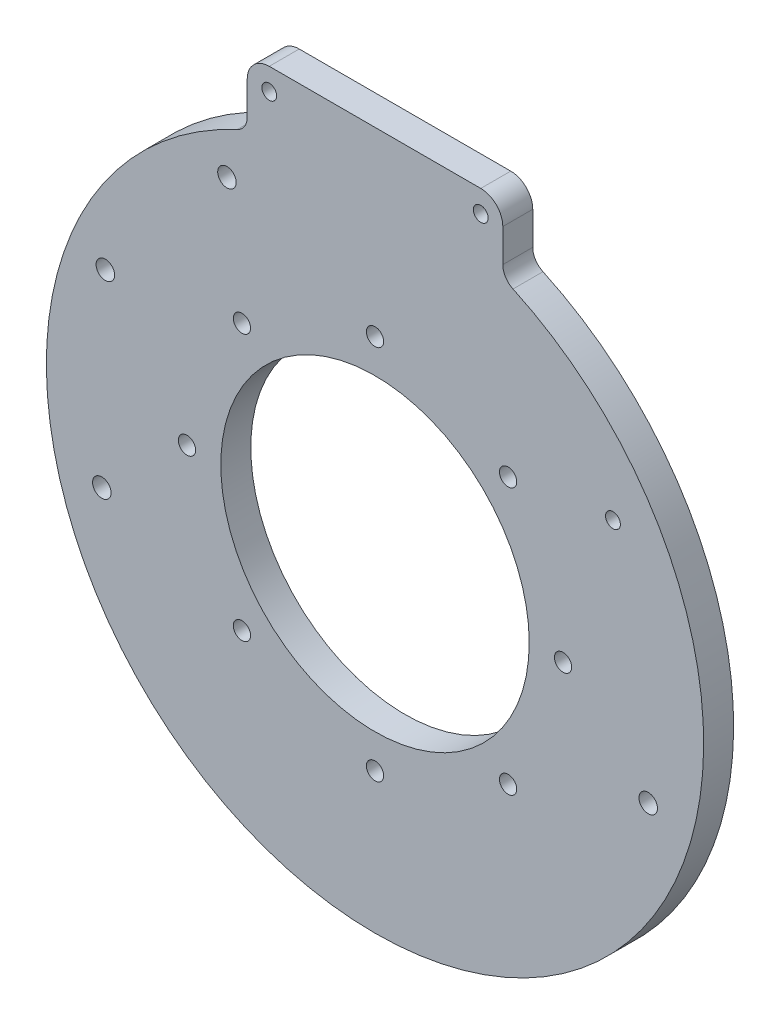
ISO-10303-21;
HEADER;
FILE_DESCRIPTION(('STEP AP214'),'2;1');
FILE_NAME('part.step','',(''),(''),'','','');
FILE_SCHEMA(('AUTOMOTIVE_DESIGN { 1 0 10303 214 1 1 1 1 }'));
ENDSEC;
DATA;
#1=APPLICATION_CONTEXT('core data for automotive mechanical design processes');
#2=APPLICATION_PROTOCOL_DEFINITION('international standard','automotive_design',2000,#1);
#3=PRODUCT_CONTEXT('',#1,'mechanical');
#4=PRODUCT('Part','Part','',(#3));
#5=PRODUCT_RELATED_PRODUCT_CATEGORY('part','',(#4));
#6=PRODUCT_DEFINITION_FORMATION('','',#4);
#7=PRODUCT_DEFINITION_CONTEXT('part definition',#1,'design');
#8=PRODUCT_DEFINITION('design','',#6,#7);
#9=PRODUCT_DEFINITION_SHAPE('','',#8);
#10=(LENGTH_UNIT() NAMED_UNIT(*) SI_UNIT(.MILLI.,.METRE.));
#11=(NAMED_UNIT(*) PLANE_ANGLE_UNIT() SI_UNIT($,.RADIAN.));
#12=(NAMED_UNIT(*) SI_UNIT($,.STERADIAN.) SOLID_ANGLE_UNIT());
#13=UNCERTAINTY_MEASURE_WITH_UNIT(LENGTH_MEASURE(1.E-05),#10,'distance_accuracy_value','');
#14=(GEOMETRIC_REPRESENTATION_CONTEXT(3) GLOBAL_UNCERTAINTY_ASSIGNED_CONTEXT((#13)) GLOBAL_UNIT_ASSIGNED_CONTEXT((#10,
#11,#12)) REPRESENTATION_CONTEXT('',''));
#15=CARTESIAN_POINT('',(0.,0.,0.));
#16=DIRECTION('',(0.,0.,1.));
#17=DIRECTION('',(1.,0.,0.));
#18=AXIS2_PLACEMENT_3D('',#15,#16,#17);
#19=CARTESIAN_POINT('',(82.5,178.304283366639,17.));
#20=DIRECTION('',(0.,0.,1.));
#21=DIRECTION('',(1.,0.,0.));
#22=AXIS2_PLACEMENT_3D('',#19,#20,#21);
#23=PLANE('',#22);
#24=CARTESIAN_POINT('',(-60.,197.,17.));
#25=DIRECTION('',(0.,0.,1.));
#26=DIRECTION('',(1.,0.,0.));
#27=AXIS2_PLACEMENT_3D('',#24,#25,#26);
#28=CIRCLE('',#27,4.2);
#29=CARTESIAN_POINT('',(-55.8,197.,17.));
#30=VERTEX_POINT('',#29);
#31=EDGE_CURVE('E358',#30,#30,#28,.T.);
#32=ORIENTED_EDGE('',*,*,#31,.F.);
#33=EDGE_LOOP('',(#32));
#34=FACE_BOUND('',#33,.T.);
#35=CARTESIAN_POINT('',(60.,197.,17.));
#36=DIRECTION('',(0.,0.,1.));
#37=DIRECTION('',(1.,0.,0.));
#38=AXIS2_PLACEMENT_3D('',#35,#36,#37);
#39=CIRCLE('',#38,4.2);
#40=CARTESIAN_POINT('',(64.2,197.,17.));
#41=VERTEX_POINT('',#40);
#42=EDGE_CURVE('E193',#41,#41,#39,.T.);
#43=ORIENTED_EDGE('',*,*,#42,.F.);
#44=EDGE_LOOP('',(#43));
#45=FACE_BOUND('',#44,.T.);
#46=CARTESIAN_POINT('',(135.,84.,17.));
#47=DIRECTION('',(0.,0.,1.));
#48=DIRECTION('',(1.,0.,0.));
#49=AXIS2_PLACEMENT_3D('',#46,#47,#48);
#50=CIRCLE('',#49,4.19999999999998);
#51=CARTESIAN_POINT('',(139.2,84.,17.));
#52=VERTEX_POINT('',#51);
#53=EDGE_CURVE('E182',#52,#52,#50,.T.);
#54=ORIENTED_EDGE('',*,*,#53,.F.);
#55=EDGE_LOOP('',(#54));
#56=FACE_BOUND('',#55,.T.);
#57=CARTESIAN_POINT('',(155.,-45.,17.));
#58=DIRECTION('',(0.,0.,1.));
#59=DIRECTION('',(1.,0.,0.));
#60=AXIS2_PLACEMENT_3D('',#57,#58,#59);
#61=CIRCLE('',#60,5.25);
#62=CARTESIAN_POINT('',(160.25,-45.,17.));
#63=VERTEX_POINT('',#62);
#64=EDGE_CURVE('E181',#63,#63,#61,.T.);
#65=ORIENTED_EDGE('',*,*,#64,.F.);
#66=EDGE_LOOP('',(#65));
#67=FACE_BOUND('',#66,.T.);
#68=CARTESIAN_POINT('',(-155.,-45.,17.));
#69=DIRECTION('',(0.,0.,1.));
#70=DIRECTION('',(1.,0.,0.));
#71=AXIS2_PLACEMENT_3D('',#68,#69,#70);
#72=CIRCLE('',#71,5.25);
#73=CARTESIAN_POINT('',(-149.75,-45.,17.));
#74=VERTEX_POINT('',#73);
#75=EDGE_CURVE('E199',#74,#74,#72,.T.);
#76=ORIENTED_EDGE('',*,*,#75,.F.);
#77=EDGE_LOOP('',(#76));
#78=FACE_BOUND('',#77,.T.);
#79=CARTESIAN_POINT('',(-153.,63.,17.));
#80=DIRECTION('',(0.,0.,1.));
#81=DIRECTION('',(1.,0.,0.));
#82=AXIS2_PLACEMENT_3D('',#79,#80,#81);
#83=CIRCLE('',#82,5.25);
#84=CARTESIAN_POINT('',(-147.75,63.,17.));
#85=VERTEX_POINT('',#84);
#86=EDGE_CURVE('E205',#85,#85,#83,.T.);
#87=ORIENTED_EDGE('',*,*,#86,.F.);
#88=EDGE_LOOP('',(#87));
#89=FACE_BOUND('',#88,.T.);
#90=CARTESIAN_POINT('',(-84.,143.,17.));
#91=DIRECTION('',(0.,0.,1.));
#92=DIRECTION('',(1.,0.,0.));
#93=AXIS2_PLACEMENT_3D('',#90,#91,#92);
#94=CIRCLE('',#93,5.24999999999999);
#95=CARTESIAN_POINT('',(-78.75,143.,17.));
#96=VERTEX_POINT('',#95);
#97=EDGE_CURVE('E211',#96,#96,#94,.T.);
#98=ORIENTED_EDGE('',*,*,#97,.F.);
#99=EDGE_LOOP('',(#98));
#100=FACE_BOUND('',#99,.T.);
#101=CARTESIAN_POINT('',(75.5071621304083,75.5071621304092,17.));
#102=DIRECTION('',(0.,0.,1.));
#103=DIRECTION('',(1.,0.,0.));
#104=AXIS2_PLACEMENT_3D('',#101,#102,#103);
#105=CIRCLE('',#104,4.9022);
#106=CARTESIAN_POINT('',(80.4093621304083,75.5071621304092,17.));
#107=VERTEX_POINT('',#106);
#108=EDGE_CURVE('E217',#107,#107,#105,.T.);
#109=ORIENTED_EDGE('',*,*,#108,.F.);
#110=EDGE_LOOP('',(#109));
#111=FACE_BOUND('',#110,.T.);
#112=CARTESIAN_POINT('',(75.5071621304155,-75.5071621304083,17.));
#113=DIRECTION('',(0.,0.,1.));
#114=DIRECTION('',(1.,0.,0.));
#115=AXIS2_PLACEMENT_3D('',#112,#113,#114);
#116=CIRCLE('',#115,4.9022);
#117=CARTESIAN_POINT('',(80.4093621304155,-75.5071621304083,17.));
#118=VERTEX_POINT('',#117);
#119=EDGE_CURVE('E178',#118,#118,#116,.T.);
#120=ORIENTED_EDGE('',*,*,#119,.F.);
#121=EDGE_LOOP('',(#120));
#122=FACE_BOUND('',#121,.T.);
#123=CARTESIAN_POINT('',(-75.507162130402,-75.5071621304155,17.));
#124=DIRECTION('',(0.,0.,1.));
#125=DIRECTION('',(1.,0.,0.));
#126=AXIS2_PLACEMENT_3D('',#123,#124,#125);
#127=CIRCLE('',#126,4.9022);
#128=CARTESIAN_POINT('',(-70.604962130402,-75.5071621304155,17.));
#129=VERTEX_POINT('',#128);
#130=EDGE_CURVE('E177',#129,#129,#127,.T.);
#131=ORIENTED_EDGE('',*,*,#130,.F.);
#132=EDGE_LOOP('',(#131));
#133=FACE_BOUND('',#132,.T.);
#134=CARTESIAN_POINT('',(-75.5071621304092,75.507162130402,17.));
#135=DIRECTION('',(0.,0.,1.));
#136=DIRECTION('',(1.,0.,0.));
#137=AXIS2_PLACEMENT_3D('',#134,#135,#136);
#138=CIRCLE('',#137,4.9022);
#139=CARTESIAN_POINT('',(-70.6049621304092,75.507162130402,17.));
#140=VERTEX_POINT('',#139);
#141=EDGE_CURVE('E174',#140,#140,#138,.T.);
#142=ORIENTED_EDGE('',*,*,#141,.F.);
#143=EDGE_LOOP('',(#142));
#144=FACE_BOUND('',#143,.T.);
#145=CARTESIAN_POINT('',(0.,106.68,17.));
#146=DIRECTION('',(0.,0.,1.));
#147=DIRECTION('',(1.,0.,0.));
#148=AXIS2_PLACEMENT_3D('',#145,#146,#147);
#149=CIRCLE('',#148,4.90219999999999);
#150=CARTESIAN_POINT('',(4.90219999999998,106.68,17.));
#151=VERTEX_POINT('',#150);
#152=EDGE_CURVE('E170',#151,#151,#149,.T.);
#153=ORIENTED_EDGE('',*,*,#152,.F.);
#154=EDGE_LOOP('',(#153));
#155=FACE_BOUND('',#154,.T.);
#156=CARTESIAN_POINT('',(106.680000000003,3.00595300391237E-12,17.));
#157=DIRECTION('',(0.,0.,1.));
#158=DIRECTION('',(1.,0.,0.));
#159=AXIS2_PLACEMENT_3D('',#156,#157,#158);
#160=CIRCLE('',#159,4.9022);
#161=CARTESIAN_POINT('',(111.582200000003,3.00595300391237E-12,17.));
#162=VERTEX_POINT('',#161);
#163=EDGE_CURVE('E169',#162,#162,#160,.T.);
#164=ORIENTED_EDGE('',*,*,#163,.F.);
#165=EDGE_LOOP('',(#164));
#166=FACE_BOUND('',#165,.T.);
#167=CARTESIAN_POINT('',(-106.679999999997,-3.01901753596567E-12,17.));
#168=DIRECTION('',(0.,0.,1.));
#169=DIRECTION('',(1.,0.,0.));
#170=AXIS2_PLACEMENT_3D('',#167,#168,#169);
#171=CIRCLE('',#170,4.9022);
#172=CARTESIAN_POINT('',(-101.777799999997,-3.01901753596567E-12,17.));
#173=VERTEX_POINT('',#172);
#174=EDGE_CURVE('E165',#173,#173,#171,.T.);
#175=ORIENTED_EDGE('',*,*,#174,.F.);
#176=EDGE_LOOP('',(#175));
#177=FACE_BOUND('',#176,.T.);
#178=CARTESIAN_POINT('',(6.01190600782474E-12,-106.68,17.));
#179=DIRECTION('',(0.,0.,1.));
#180=DIRECTION('',(1.,0.,0.));
#181=AXIS2_PLACEMENT_3D('',#178,#179,#180);
#182=CIRCLE('',#181,4.90219999999999);
#183=CARTESIAN_POINT('',(4.902200000006,-106.68,17.));
#184=VERTEX_POINT('',#183);
#185=EDGE_CURVE('E164',#184,#184,#182,.T.);
#186=ORIENTED_EDGE('',*,*,#185,.F.);
#187=EDGE_LOOP('',(#186));
#188=FACE_BOUND('',#187,.T.);
#189=CARTESIAN_POINT('',(82.5,178.304283366639,17.));
#190=DIRECTION('',(0.,0.,-1.));
#191=DIRECTION('',(1.,0.,0.));
#192=AXIS2_PLACEMENT_3D('',#189,#190,#191);
#193=CIRCLE('',#192,10.);
#194=CARTESIAN_POINT('',(78.3007880795387,169.228677643215,17.));
#195=VERTEX_POINT('',#194);
#196=CARTESIAN_POINT('',(72.5,178.304283366639,17.));
#197=VERTEX_POINT('',#196);
#198=EDGE_CURVE('E149',#195,#197,#193,.T.);
#199=ORIENTED_EDGE('',*,*,#198,.T.);
#200=DIRECTION('',(0.,1.,0.));
#201=VECTOR('',#200,1.);
#202=CARTESIAN_POINT('',(72.5,197.,17.));
#203=LINE('',#202,#201);
#204=CARTESIAN_POINT('',(72.5,197.,17.));
#205=VERTEX_POINT('',#204);
#206=EDGE_CURVE('E97',#197,#205,#203,.T.);
#207=ORIENTED_EDGE('',*,*,#206,.T.);
#208=CARTESIAN_POINT('',(60.,197.,17.));
#209=DIRECTION('',(0.,0.,1.));
#210=DIRECTION('',(1.,0.,0.));
#211=AXIS2_PLACEMENT_3D('',#208,#209,#210);
#212=CIRCLE('',#211,12.5);
#213=CARTESIAN_POINT('',(60.,209.5,17.));
#214=VERTEX_POINT('',#213);
#215=EDGE_CURVE('E253',#205,#214,#212,.T.);
#216=ORIENTED_EDGE('',*,*,#215,.T.);
#217=DIRECTION('',(-1.,0.,0.));
#218=VECTOR('',#217,1.);
#219=CARTESIAN_POINT('',(-60.,209.5,17.));
#220=LINE('',#219,#218);
#221=CARTESIAN_POINT('',(-60.,209.5,17.));
#222=VERTEX_POINT('',#221);
#223=EDGE_CURVE('E255',#214,#222,#220,.T.);
#224=ORIENTED_EDGE('',*,*,#223,.T.);
#225=CARTESIAN_POINT('',(-60.,197.,17.));
#226=DIRECTION('',(0.,0.,1.));
#227=DIRECTION('',(1.,0.,0.));
#228=AXIS2_PLACEMENT_3D('',#225,#226,#227);
#229=CIRCLE('',#228,12.5);
#230=CARTESIAN_POINT('',(-72.5,197.,17.));
#231=VERTEX_POINT('',#230);
#232=EDGE_CURVE('E116',#222,#231,#229,.T.);
#233=ORIENTED_EDGE('',*,*,#232,.T.);
#234=DIRECTION('',(0.,-1.,0.));
#235=VECTOR('',#234,1.);
#236=CARTESIAN_POINT('',(-72.5,197.,17.));
#237=LINE('',#236,#235);
#238=CARTESIAN_POINT('',(-72.5,178.304283366639,17.));
#239=VERTEX_POINT('',#238);
#240=EDGE_CURVE('E110',#231,#239,#237,.T.);
#241=ORIENTED_EDGE('',*,*,#240,.T.);
#242=CARTESIAN_POINT('',(-82.5,178.304283366639,17.));
#243=DIRECTION('',(0.,0.,-1.));
#244=DIRECTION('',(-1.,0.,0.));
#245=AXIS2_PLACEMENT_3D('',#242,#243,#244);
#246=CIRCLE('',#245,10.);
#247=CARTESIAN_POINT('',(-78.3007880795386,169.228677643215,17.));
#248=VERTEX_POINT('',#247);
#249=EDGE_CURVE('E114',#239,#248,#246,.T.);
#250=ORIENTED_EDGE('',*,*,#249,.T.);
#251=CARTESIAN_POINT('',(0.,0.,17.));
#252=DIRECTION('',(0.,0.,1.));
#253=DIRECTION('',(1.,0.,0.));
#254=AXIS2_PLACEMENT_3D('',#251,#252,#253);
#255=CIRCLE('',#254,186.465435807143);
#256=EDGE_CURVE('E54',#248,#195,#255,.T.);
#257=ORIENTED_EDGE('',*,*,#256,.T.);
#258=EDGE_LOOP('',(#199,#207,#216,#224,#233,#241,#250,#257));
#259=FACE_BOUND('',#258,.T.);
#260=CARTESIAN_POINT('',(0.,0.,17.));
#261=DIRECTION('',(0.,0.,1.));
#262=DIRECTION('',(1.,0.,0.));
#263=AXIS2_PLACEMENT_3D('',#260,#261,#262);
#264=CIRCLE('',#263,87.5);
#265=CARTESIAN_POINT('',(87.5,0.,17.));
#266=VERTEX_POINT('',#265);
#267=EDGE_CURVE('E138',#266,#266,#264,.T.);
#268=ORIENTED_EDGE('',*,*,#267,.F.);
#269=EDGE_LOOP('',(#268));
#270=FACE_BOUND('',#269,.T.);
#271=ADVANCED_FACE('F35',(#34,#45,#56,#67,#78,#89,#100,#111,#122,#133,#144,#155,#166,#177,#188,
#259,#270),#23,.T.);
#272=CARTESIAN_POINT('',(82.5,178.304283366639,0.));
#273=DIRECTION('',(0.,0.,1.));
#274=DIRECTION('',(1.,0.,0.));
#275=AXIS2_PLACEMENT_3D('',#272,#273,#274);
#276=PLANE('',#275);
#277=CARTESIAN_POINT('',(-60.,197.,0.));
#278=DIRECTION('',(0.,0.,1.));
#279=DIRECTION('',(1.,0.,0.));
#280=AXIS2_PLACEMENT_3D('',#277,#278,#279);
#281=CIRCLE('',#280,4.19999999999999);
#282=CARTESIAN_POINT('',(-55.8,197.,0.));
#283=VERTEX_POINT('',#282);
#284=EDGE_CURVE('E361',#283,#283,#281,.T.);
#285=ORIENTED_EDGE('',*,*,#284,.T.);
#286=EDGE_LOOP('',(#285));
#287=FACE_BOUND('',#286,.T.);
#288=CARTESIAN_POINT('',(60.,197.,0.));
#289=DIRECTION('',(0.,0.,1.));
#290=DIRECTION('',(1.,0.,0.));
#291=AXIS2_PLACEMENT_3D('',#288,#289,#290);
#292=CIRCLE('',#291,4.19999999999999);
#293=CARTESIAN_POINT('',(64.2,197.,0.));
#294=VERTEX_POINT('',#293);
#295=EDGE_CURVE('E39',#294,#294,#292,.T.);
#296=ORIENTED_EDGE('',*,*,#295,.T.);
#297=EDGE_LOOP('',(#296));
#298=FACE_BOUND('',#297,.T.);
#299=CARTESIAN_POINT('',(135.,84.,0.));
#300=DIRECTION('',(0.,0.,1.));
#301=DIRECTION('',(1.,0.,0.));
#302=AXIS2_PLACEMENT_3D('',#299,#300,#301);
#303=CIRCLE('',#302,4.19999999999998);
#304=CARTESIAN_POINT('',(139.2,84.,0.));
#305=VERTEX_POINT('',#304);
#306=EDGE_CURVE('E179',#305,#305,#303,.T.);
#307=ORIENTED_EDGE('',*,*,#306,.T.);
#308=EDGE_LOOP('',(#307));
#309=FACE_BOUND('',#308,.T.);
#310=CARTESIAN_POINT('',(155.,-45.,0.));
#311=DIRECTION('',(0.,0.,1.));
#312=DIRECTION('',(1.,0.,0.));
#313=AXIS2_PLACEMENT_3D('',#310,#311,#312);
#314=CIRCLE('',#313,5.24999999999999);
#315=CARTESIAN_POINT('',(160.25,-45.,0.));
#316=VERTEX_POINT('',#315);
#317=EDGE_CURVE('E186',#316,#316,#314,.T.);
#318=ORIENTED_EDGE('',*,*,#317,.T.);
#319=EDGE_LOOP('',(#318));
#320=FACE_BOUND('',#319,.T.);
#321=CARTESIAN_POINT('',(-155.,-45.,0.));
#322=DIRECTION('',(0.,0.,1.));
#323=DIRECTION('',(1.,0.,0.));
#324=AXIS2_PLACEMENT_3D('',#321,#322,#323);
#325=CIRCLE('',#324,5.24999999999999);
#326=CARTESIAN_POINT('',(-149.75,-45.,0.));
#327=VERTEX_POINT('',#326);
#328=EDGE_CURVE('E202',#327,#327,#325,.T.);
#329=ORIENTED_EDGE('',*,*,#328,.T.);
#330=EDGE_LOOP('',(#329));
#331=FACE_BOUND('',#330,.T.);
#332=CARTESIAN_POINT('',(-153.,63.,0.));
#333=DIRECTION('',(0.,0.,1.));
#334=DIRECTION('',(1.,0.,0.));
#335=AXIS2_PLACEMENT_3D('',#332,#333,#334);
#336=CIRCLE('',#335,5.24999999999999);
#337=CARTESIAN_POINT('',(-147.75,63.,0.));
#338=VERTEX_POINT('',#337);
#339=EDGE_CURVE('E208',#338,#338,#336,.T.);
#340=ORIENTED_EDGE('',*,*,#339,.T.);
#341=EDGE_LOOP('',(#340));
#342=FACE_BOUND('',#341,.T.);
#343=CARTESIAN_POINT('',(-84.,143.,0.));
#344=DIRECTION('',(0.,0.,1.));
#345=DIRECTION('',(1.,0.,0.));
#346=AXIS2_PLACEMENT_3D('',#343,#344,#345);
#347=CIRCLE('',#346,5.24999999999999);
#348=CARTESIAN_POINT('',(-78.75,143.,0.));
#349=VERTEX_POINT('',#348);
#350=EDGE_CURVE('E214',#349,#349,#347,.T.);
#351=ORIENTED_EDGE('',*,*,#350,.T.);
#352=EDGE_LOOP('',(#351));
#353=FACE_BOUND('',#352,.T.);
#354=CARTESIAN_POINT('',(75.5071621304083,75.5071621304092,0.));
#355=DIRECTION('',(0.,0.,1.));
#356=DIRECTION('',(1.,0.,0.));
#357=AXIS2_PLACEMENT_3D('',#354,#355,#356);
#358=CIRCLE('',#357,4.90219999999999);
#359=CARTESIAN_POINT('',(80.4093621304083,75.5071621304092,0.));
#360=VERTEX_POINT('',#359);
#361=EDGE_CURVE('E220',#360,#360,#358,.T.);
#362=ORIENTED_EDGE('',*,*,#361,.T.);
#363=EDGE_LOOP('',(#362));
#364=FACE_BOUND('',#363,.T.);
#365=CARTESIAN_POINT('',(75.5071621304155,-75.5071621304083,0.));
#366=DIRECTION('',(0.,0.,1.));
#367=DIRECTION('',(1.,0.,0.));
#368=AXIS2_PLACEMENT_3D('',#365,#366,#367);
#369=CIRCLE('',#368,4.90219999999999);
#370=CARTESIAN_POINT('',(80.4093621304155,-75.5071621304083,0.));
#371=VERTEX_POINT('',#370);
#372=EDGE_CURVE('E175',#371,#371,#369,.T.);
#373=ORIENTED_EDGE('',*,*,#372,.T.);
#374=EDGE_LOOP('',(#373));
#375=FACE_BOUND('',#374,.T.);
#376=CARTESIAN_POINT('',(-75.507162130402,-75.5071621304155,0.));
#377=DIRECTION('',(0.,0.,1.));
#378=DIRECTION('',(1.,0.,0.));
#379=AXIS2_PLACEMENT_3D('',#376,#377,#378);
#380=CIRCLE('',#379,4.90219999999999);
#381=CARTESIAN_POINT('',(-70.604962130402,-75.5071621304155,0.));
#382=VERTEX_POINT('',#381);
#383=EDGE_CURVE('E227',#382,#382,#380,.T.);
#384=ORIENTED_EDGE('',*,*,#383,.T.);
#385=EDGE_LOOP('',(#384));
#386=FACE_BOUND('',#385,.T.);
#387=CARTESIAN_POINT('',(-75.5071621304092,75.507162130402,0.));
#388=DIRECTION('',(0.,0.,1.));
#389=DIRECTION('',(1.,0.,0.));
#390=AXIS2_PLACEMENT_3D('',#387,#388,#389);
#391=CIRCLE('',#390,4.90219999999999);
#392=CARTESIAN_POINT('',(-70.6049621304092,75.507162130402,0.));
#393=VERTEX_POINT('',#392);
#394=EDGE_CURVE('E171',#393,#393,#391,.T.);
#395=ORIENTED_EDGE('',*,*,#394,.T.);
#396=EDGE_LOOP('',(#395));
#397=FACE_BOUND('',#396,.T.);
#398=CARTESIAN_POINT('',(0.,106.68,0.));
#399=DIRECTION('',(0.,0.,1.));
#400=DIRECTION('',(1.,0.,0.));
#401=AXIS2_PLACEMENT_3D('',#398,#399,#400);
#402=CIRCLE('',#401,4.90219999999999);
#403=CARTESIAN_POINT('',(4.90219999999998,106.68,0.));
#404=VERTEX_POINT('',#403);
#405=EDGE_CURVE('E166',#404,#404,#402,.T.);
#406=ORIENTED_EDGE('',*,*,#405,.T.);
#407=EDGE_LOOP('',(#406));
#408=FACE_BOUND('',#407,.T.);
#409=CARTESIAN_POINT('',(106.680000000003,3.00595300391237E-12,0.));
#410=DIRECTION('',(0.,0.,1.));
#411=DIRECTION('',(1.,0.,0.));
#412=AXIS2_PLACEMENT_3D('',#409,#410,#411);
#413=CIRCLE('',#412,4.90219999999999);
#414=CARTESIAN_POINT('',(111.582200000003,3.00595300391237E-12,0.));
#415=VERTEX_POINT('',#414);
#416=EDGE_CURVE('E236',#415,#415,#413,.T.);
#417=ORIENTED_EDGE('',*,*,#416,.T.);
#418=EDGE_LOOP('',(#417));
#419=FACE_BOUND('',#418,.T.);
#420=CARTESIAN_POINT('',(-106.679999999997,-3.01901753596567E-12,0.));
#421=DIRECTION('',(0.,0.,1.));
#422=DIRECTION('',(1.,0.,0.));
#423=AXIS2_PLACEMENT_3D('',#420,#421,#422);
#424=CIRCLE('',#423,4.90219999999999);
#425=CARTESIAN_POINT('',(-101.777799999997,-3.01901753596567E-12,0.));
#426=VERTEX_POINT('',#425);
#427=EDGE_CURVE('E161',#426,#426,#424,.T.);
#428=ORIENTED_EDGE('',*,*,#427,.T.);
#429=EDGE_LOOP('',(#428));
#430=FACE_BOUND('',#429,.T.);
#431=CARTESIAN_POINT('',(6.01190600782474E-12,-106.68,0.));
#432=DIRECTION('',(0.,0.,1.));
#433=DIRECTION('',(1.,0.,0.));
#434=AXIS2_PLACEMENT_3D('',#431,#432,#433);
#435=CIRCLE('',#434,4.90219999999999);
#436=CARTESIAN_POINT('',(4.902200000006,-106.68,0.));
#437=VERTEX_POINT('',#436);
#438=EDGE_CURVE('E243',#437,#437,#435,.T.);
#439=ORIENTED_EDGE('',*,*,#438,.T.);
#440=EDGE_LOOP('',(#439));
#441=FACE_BOUND('',#440,.T.);
#442=CARTESIAN_POINT('',(82.5,178.304283366639,0.));
#443=DIRECTION('',(0.,0.,-1.));
#444=DIRECTION('',(1.,0.,0.));
#445=AXIS2_PLACEMENT_3D('',#442,#443,#444);
#446=CIRCLE('',#445,10.);
#447=CARTESIAN_POINT('',(78.3007880795387,169.228677643215,0.));
#448=VERTEX_POINT('',#447);
#449=CARTESIAN_POINT('',(72.5,178.304283366639,0.));
#450=VERTEX_POINT('',#449);
#451=EDGE_CURVE('E134',#448,#450,#446,.T.);
#452=ORIENTED_EDGE('',*,*,#451,.F.);
#453=CARTESIAN_POINT('',(0.,0.,0.));
#454=DIRECTION('',(0.,0.,1.));
#455=DIRECTION('',(1.,0.,0.));
#456=AXIS2_PLACEMENT_3D('',#453,#454,#455);
#457=CIRCLE('',#456,186.465435807143);
#458=CARTESIAN_POINT('',(-78.3007880795386,169.228677643215,0.));
#459=VERTEX_POINT('',#458);
#460=EDGE_CURVE('E89',#459,#448,#457,.T.);
#461=ORIENTED_EDGE('',*,*,#460,.F.);
#462=CARTESIAN_POINT('',(-82.5,178.304283366639,0.));
#463=DIRECTION('',(0.,0.,-1.));
#464=DIRECTION('',(-1.,0.,0.));
#465=AXIS2_PLACEMENT_3D('',#462,#463,#464);
#466=CIRCLE('',#465,10.);
#467=CARTESIAN_POINT('',(-72.5,178.304283366639,0.));
#468=VERTEX_POINT('',#467);
#469=EDGE_CURVE('E83',#468,#459,#466,.T.);
#470=ORIENTED_EDGE('',*,*,#469,.F.);
#471=DIRECTION('',(0.,-1.,0.));
#472=VECTOR('',#471,1.);
#473=CARTESIAN_POINT('',(-72.5,197.,0.));
#474=LINE('',#473,#472);
#475=CARTESIAN_POINT('',(-72.5,197.,0.));
#476=VERTEX_POINT('',#475);
#477=EDGE_CURVE('E124',#476,#468,#474,.T.);
#478=ORIENTED_EDGE('',*,*,#477,.F.);
#479=CARTESIAN_POINT('',(-60.,197.,0.));
#480=DIRECTION('',(0.,0.,1.));
#481=DIRECTION('',(1.,0.,0.));
#482=AXIS2_PLACEMENT_3D('',#479,#480,#481);
#483=CIRCLE('',#482,12.5);
#484=CARTESIAN_POINT('',(-60.,209.5,0.));
#485=VERTEX_POINT('',#484);
#486=EDGE_CURVE('E144',#485,#476,#483,.T.);
#487=ORIENTED_EDGE('',*,*,#486,.F.);
#488=DIRECTION('',(-1.,0.,0.));
#489=VECTOR('',#488,1.);
#490=CARTESIAN_POINT('',(-60.,209.5,0.));
#491=LINE('',#490,#489);
#492=CARTESIAN_POINT('',(60.,209.5,0.));
#493=VERTEX_POINT('',#492);
#494=EDGE_CURVE('E142',#493,#485,#491,.T.);
#495=ORIENTED_EDGE('',*,*,#494,.F.);
#496=CARTESIAN_POINT('',(60.,197.,0.));
#497=DIRECTION('',(0.,0.,1.));
#498=DIRECTION('',(1.,0.,0.));
#499=AXIS2_PLACEMENT_3D('',#496,#497,#498);
#500=CIRCLE('',#499,12.5);
#501=CARTESIAN_POINT('',(72.5,197.,0.));
#502=VERTEX_POINT('',#501);
#503=EDGE_CURVE('E140',#502,#493,#500,.T.);
#504=ORIENTED_EDGE('',*,*,#503,.F.);
#505=DIRECTION('',(0.,1.,0.));
#506=VECTOR('',#505,1.);
#507=CARTESIAN_POINT('',(72.5,197.,0.));
#508=LINE('',#507,#506);
#509=EDGE_CURVE('E137',#450,#502,#508,.T.);
#510=ORIENTED_EDGE('',*,*,#509,.F.);
#511=EDGE_LOOP('',(#452,#461,#470,#478,#487,#495,#504,#510));
#512=FACE_BOUND('',#511,.T.);
#513=CARTESIAN_POINT('',(0.,0.,0.));
#514=DIRECTION('',(0.,0.,1.));
#515=DIRECTION('',(1.,0.,0.));
#516=AXIS2_PLACEMENT_3D('',#513,#514,#515);
#517=CIRCLE('',#516,87.5);
#518=CARTESIAN_POINT('',(87.5,0.,0.));
#519=VERTEX_POINT('',#518);
#520=EDGE_CURVE('E246',#519,#519,#517,.T.);
#521=ORIENTED_EDGE('',*,*,#520,.T.);
#522=EDGE_LOOP('',(#521));
#523=FACE_BOUND('',#522,.T.);
#524=ADVANCED_FACE('F268',(#287,#298,#309,#320,#331,#342,#353,#364,#375,#386,#397,#408,#419,
#430,#441,#512,#523),#276,.F.);
#525=CARTESIAN_POINT('',(82.5,178.304283366639,17.));
#526=DIRECTION('',(0.,0.,-1.));
#527=DIRECTION('',(-1.,0.,0.));
#528=AXIS2_PLACEMENT_3D('',#525,#526,#527);
#529=CYLINDRICAL_SURFACE('',#528,10.);
#530=ORIENTED_EDGE('',*,*,#451,.T.);
#531=DIRECTION('',(0.,0.,-1.));
#532=VECTOR('',#531,1.);
#533=CARTESIAN_POINT('',(72.5,178.304283366639,17.));
#534=LINE('',#533,#532);
#535=EDGE_CURVE('E11',#197,#450,#534,.T.);
#536=ORIENTED_EDGE('',*,*,#535,.F.);
#537=ORIENTED_EDGE('',*,*,#198,.F.);
#538=DIRECTION('',(0.,0.,-1.));
#539=VECTOR('',#538,1.);
#540=CARTESIAN_POINT('',(78.3007880795387,169.228677643215,17.));
#541=LINE('',#540,#539);
#542=EDGE_CURVE('E130',#195,#448,#541,.T.);
#543=ORIENTED_EDGE('',*,*,#542,.T.);
#544=EDGE_LOOP('',(#530,#536,#537,#543));
#545=FACE_BOUND('',#544,.T.);
#546=ADVANCED_FACE('F37',(#545),#529,.F.);
#547=CARTESIAN_POINT('',(72.5,197.,17.));
#548=DIRECTION('',(-1.,0.,0.));
#549=DIRECTION('',(0.,0.,1.));
#550=AXIS2_PLACEMENT_3D('',#547,#548,#549);
#551=PLANE('',#550);
#552=ORIENTED_EDGE('',*,*,#509,.T.);
#553=DIRECTION('',(0.,0.,-1.));
#554=VECTOR('',#553,1.);
#555=CARTESIAN_POINT('',(72.5,197.,17.));
#556=LINE('',#555,#554);
#557=EDGE_CURVE('E45',#205,#502,#556,.T.);
#558=ORIENTED_EDGE('',*,*,#557,.F.);
#559=ORIENTED_EDGE('',*,*,#206,.F.);
#560=ORIENTED_EDGE('',*,*,#535,.T.);
#561=EDGE_LOOP('',(#552,#558,#559,#560));
#562=FACE_BOUND('',#561,.T.);
#563=ADVANCED_FACE('F534',(#562),#551,.F.);
#564=CARTESIAN_POINT('',(60.,197.,17.));
#565=DIRECTION('',(0.,0.,-1.));
#566=DIRECTION('',(-1.,0.,0.));
#567=AXIS2_PLACEMENT_3D('',#564,#565,#566);
#568=CYLINDRICAL_SURFACE('',#567,12.5);
#569=ORIENTED_EDGE('',*,*,#503,.T.);
#570=DIRECTION('',(0.,0.,-1.));
#571=VECTOR('',#570,1.);
#572=CARTESIAN_POINT('',(60.,209.5,17.));
#573=LINE('',#572,#571);
#574=EDGE_CURVE('E156',#214,#493,#573,.T.);
#575=ORIENTED_EDGE('',*,*,#574,.F.);
#576=ORIENTED_EDGE('',*,*,#215,.F.);
#577=ORIENTED_EDGE('',*,*,#557,.T.);
#578=EDGE_LOOP('',(#569,#575,#576,#577));
#579=FACE_BOUND('',#578,.T.);
#580=ADVANCED_FACE('F525',(#579),#568,.T.);
#581=CARTESIAN_POINT('',(-60.,209.5,17.));
#582=DIRECTION('',(0.,-1.,0.));
#583=DIRECTION('',(0.,0.,-1.));
#584=AXIS2_PLACEMENT_3D('',#581,#582,#583);
#585=PLANE('',#584);
#586=ORIENTED_EDGE('',*,*,#494,.T.);
#587=DIRECTION('',(0.,0.,-1.));
#588=VECTOR('',#587,1.);
#589=CARTESIAN_POINT('',(-60.,209.5,17.));
#590=LINE('',#589,#588);
#591=EDGE_CURVE('E153',#222,#485,#590,.T.);
#592=ORIENTED_EDGE('',*,*,#591,.F.);
#593=ORIENTED_EDGE('',*,*,#223,.F.);
#594=ORIENTED_EDGE('',*,*,#574,.T.);
#595=EDGE_LOOP('',(#586,#592,#593,#594));
#596=FACE_BOUND('',#595,.T.);
#597=ADVANCED_FACE('F261',(#596),#585,.F.);
#598=CARTESIAN_POINT('',(-60.,197.,17.));
#599=DIRECTION('',(0.,0.,-1.));
#600=DIRECTION('',(-1.,0.,0.));
#601=AXIS2_PLACEMENT_3D('',#598,#599,#600);
#602=CYLINDRICAL_SURFACE('',#601,12.5);
#603=ORIENTED_EDGE('',*,*,#486,.T.);
#604=DIRECTION('',(0.,0.,-1.));
#605=VECTOR('',#604,1.);
#606=CARTESIAN_POINT('',(-72.5,197.,17.));
#607=LINE('',#606,#605);
#608=EDGE_CURVE('E125',#231,#476,#607,.T.);
#609=ORIENTED_EDGE('',*,*,#608,.F.);
#610=ORIENTED_EDGE('',*,*,#232,.F.);
#611=ORIENTED_EDGE('',*,*,#591,.T.);
#612=EDGE_LOOP('',(#603,#609,#610,#611));
#613=FACE_BOUND('',#612,.T.);
#614=ADVANCED_FACE('F265',(#613),#602,.T.);
#615=CARTESIAN_POINT('',(-72.5,197.,17.));
#616=DIRECTION('',(1.,0.,0.));
#617=DIRECTION('',(0.,0.,-1.));
#618=AXIS2_PLACEMENT_3D('',#615,#616,#617);
#619=PLANE('',#618);
#620=ORIENTED_EDGE('',*,*,#477,.T.);
#621=DIRECTION('',(0.,0.,-1.));
#622=VECTOR('',#621,1.);
#623=CARTESIAN_POINT('',(-72.5,178.304283366639,17.));
#624=LINE('',#623,#622);
#625=EDGE_CURVE('E121',#239,#468,#624,.T.);
#626=ORIENTED_EDGE('',*,*,#625,.F.);
#627=ORIENTED_EDGE('',*,*,#240,.F.);
#628=ORIENTED_EDGE('',*,*,#608,.T.);
#629=EDGE_LOOP('',(#620,#626,#627,#628));
#630=FACE_BOUND('',#629,.T.);
#631=ADVANCED_FACE('F122',(#630),#619,.F.);
#632=CARTESIAN_POINT('',(-82.5,178.304283366639,17.));
#633=DIRECTION('',(0.,0.,-1.));
#634=DIRECTION('',(-1.,0.,0.));
#635=AXIS2_PLACEMENT_3D('',#632,#633,#634);
#636=CYLINDRICAL_SURFACE('',#635,10.);
#637=ORIENTED_EDGE('',*,*,#469,.T.);
#638=DIRECTION('',(0.,0.,-1.));
#639=VECTOR('',#638,1.);
#640=CARTESIAN_POINT('',(-78.3007880795386,169.228677643215,17.));
#641=LINE('',#640,#639);
#642=EDGE_CURVE('E126',#248,#459,#641,.T.);
#643=ORIENTED_EDGE('',*,*,#642,.F.);
#644=ORIENTED_EDGE('',*,*,#249,.F.);
#645=ORIENTED_EDGE('',*,*,#625,.T.);
#646=EDGE_LOOP('',(#637,#643,#644,#645));
#647=FACE_BOUND('',#646,.T.);
#648=ADVANCED_FACE('F128',(#647),#636,.F.);
#649=CARTESIAN_POINT('',(0.,0.,17.));
#650=DIRECTION('',(0.,0.,-1.));
#651=DIRECTION('',(-1.,0.,0.));
#652=AXIS2_PLACEMENT_3D('',#649,#650,#651);
#653=CYLINDRICAL_SURFACE('',#652,186.465435807143);
#654=ORIENTED_EDGE('',*,*,#460,.T.);
#655=ORIENTED_EDGE('',*,*,#542,.F.);
#656=ORIENTED_EDGE('',*,*,#256,.F.);
#657=ORIENTED_EDGE('',*,*,#642,.T.);
#658=EDGE_LOOP('',(#654,#655,#656,#657));
#659=FACE_BOUND('',#658,.T.);
#660=ADVANCED_FACE('F274',(#659),#653,.T.);
#661=CARTESIAN_POINT('',(0.,0.,17.));
#662=DIRECTION('',(0.,0.,-1.));
#663=DIRECTION('',(-1.,0.,0.));
#664=AXIS2_PLACEMENT_3D('',#661,#662,#663);
#665=CYLINDRICAL_SURFACE('',#664,87.5);
#666=ORIENTED_EDGE('',*,*,#267,.T.);
#667=EDGE_LOOP('',(#666));
#668=FACE_BOUND('',#667,.T.);
#669=ORIENTED_EDGE('',*,*,#520,.F.);
#670=EDGE_LOOP('',(#669));
#671=FACE_BOUND('',#670,.T.);
#672=ADVANCED_FACE('F276',(#668,#671),#665,.F.);
#673=CARTESIAN_POINT('',(6.01190600782474E-12,-106.68,17.));
#674=DIRECTION('',(0.,0.,1.));
#675=DIRECTION('',(1.,0.,0.));
#676=AXIS2_PLACEMENT_3D('',#673,#674,#675);
#677=CYLINDRICAL_SURFACE('',#676,4.90219999999999);
#678=ORIENTED_EDGE('',*,*,#185,.T.);
#679=EDGE_LOOP('',(#678));
#680=FACE_BOUND('',#679,.T.);
#681=ORIENTED_EDGE('',*,*,#438,.F.);
#682=EDGE_LOOP('',(#681));
#683=FACE_BOUND('',#682,.T.);
#684=ADVANCED_FACE('F282',(#680,#683),#677,.F.);
#685=CARTESIAN_POINT('',(-106.679999999997,-3.01901753596567E-12,17.));
#686=DIRECTION('',(0.,0.,1.));
#687=DIRECTION('',(1.,0.,0.));
#688=AXIS2_PLACEMENT_3D('',#685,#686,#687);
#689=CYLINDRICAL_SURFACE('',#688,4.90219999999999);
#690=ORIENTED_EDGE('',*,*,#174,.T.);
#691=EDGE_LOOP('',(#690));
#692=FACE_BOUND('',#691,.T.);
#693=ORIENTED_EDGE('',*,*,#427,.F.);
#694=EDGE_LOOP('',(#693));
#695=FACE_BOUND('',#694,.T.);
#696=ADVANCED_FACE('F299',(#692,#695),#689,.F.);
#697=CARTESIAN_POINT('',(106.680000000003,3.00595300391237E-12,17.));
#698=DIRECTION('',(0.,0.,1.));
#699=DIRECTION('',(1.,0.,0.));
#700=AXIS2_PLACEMENT_3D('',#697,#698,#699);
#701=CYLINDRICAL_SURFACE('',#700,4.90219999999999);
#702=ORIENTED_EDGE('',*,*,#163,.T.);
#703=EDGE_LOOP('',(#702));
#704=FACE_BOUND('',#703,.T.);
#705=ORIENTED_EDGE('',*,*,#416,.F.);
#706=EDGE_LOOP('',(#705));
#707=FACE_BOUND('',#706,.T.);
#708=ADVANCED_FACE('F303',(#704,#707),#701,.F.);
#709=CARTESIAN_POINT('',(0.,106.68,17.));
#710=DIRECTION('',(0.,0.,1.));
#711=DIRECTION('',(1.,0.,0.));
#712=AXIS2_PLACEMENT_3D('',#709,#710,#711);
#713=CYLINDRICAL_SURFACE('',#712,4.90219999999999);
#714=ORIENTED_EDGE('',*,*,#152,.T.);
#715=EDGE_LOOP('',(#714));
#716=FACE_BOUND('',#715,.T.);
#717=ORIENTED_EDGE('',*,*,#405,.F.);
#718=EDGE_LOOP('',(#717));
#719=FACE_BOUND('',#718,.T.);
#720=ADVANCED_FACE('F307',(#716,#719),#713,.F.);
#721=CARTESIAN_POINT('',(-75.5071621304092,75.507162130402,17.));
#722=DIRECTION('',(0.,0.,1.));
#723=DIRECTION('',(1.,0.,0.));
#724=AXIS2_PLACEMENT_3D('',#721,#722,#723);
#725=CYLINDRICAL_SURFACE('',#724,4.90219999999999);
#726=ORIENTED_EDGE('',*,*,#141,.T.);
#727=EDGE_LOOP('',(#726));
#728=FACE_BOUND('',#727,.T.);
#729=ORIENTED_EDGE('',*,*,#394,.F.);
#730=EDGE_LOOP('',(#729));
#731=FACE_BOUND('',#730,.T.);
#732=ADVANCED_FACE('F311',(#728,#731),#725,.F.);
#733=CARTESIAN_POINT('',(-75.507162130402,-75.5071621304155,17.));
#734=DIRECTION('',(0.,0.,1.));
#735=DIRECTION('',(1.,0.,0.));
#736=AXIS2_PLACEMENT_3D('',#733,#734,#735);
#737=CYLINDRICAL_SURFACE('',#736,4.90219999999999);
#738=ORIENTED_EDGE('',*,*,#130,.T.);
#739=EDGE_LOOP('',(#738));
#740=FACE_BOUND('',#739,.T.);
#741=ORIENTED_EDGE('',*,*,#383,.F.);
#742=EDGE_LOOP('',(#741));
#743=FACE_BOUND('',#742,.T.);
#744=ADVANCED_FACE('F315',(#740,#743),#737,.F.);
#745=CARTESIAN_POINT('',(75.5071621304155,-75.5071621304083,17.));
#746=DIRECTION('',(0.,0.,1.));
#747=DIRECTION('',(1.,0.,0.));
#748=AXIS2_PLACEMENT_3D('',#745,#746,#747);
#749=CYLINDRICAL_SURFACE('',#748,4.90219999999999);
#750=ORIENTED_EDGE('',*,*,#119,.T.);
#751=EDGE_LOOP('',(#750));
#752=FACE_BOUND('',#751,.T.);
#753=ORIENTED_EDGE('',*,*,#372,.F.);
#754=EDGE_LOOP('',(#753));
#755=FACE_BOUND('',#754,.T.);
#756=ADVANCED_FACE('F319',(#752,#755),#749,.F.);
#757=CARTESIAN_POINT('',(75.5071621304083,75.5071621304092,17.));
#758=DIRECTION('',(0.,0.,1.));
#759=DIRECTION('',(1.,0.,0.));
#760=AXIS2_PLACEMENT_3D('',#757,#758,#759);
#761=CYLINDRICAL_SURFACE('',#760,4.90219999999999);
#762=ORIENTED_EDGE('',*,*,#108,.T.);
#763=EDGE_LOOP('',(#762));
#764=FACE_BOUND('',#763,.T.);
#765=ORIENTED_EDGE('',*,*,#361,.F.);
#766=EDGE_LOOP('',(#765));
#767=FACE_BOUND('',#766,.T.);
#768=ADVANCED_FACE('F323',(#764,#767),#761,.F.);
#769=CARTESIAN_POINT('',(-84.,143.,17.));
#770=DIRECTION('',(0.,0.,1.));
#771=DIRECTION('',(1.,0.,0.));
#772=AXIS2_PLACEMENT_3D('',#769,#770,#771);
#773=CYLINDRICAL_SURFACE('',#772,5.24999999999999);
#774=ORIENTED_EDGE('',*,*,#97,.T.);
#775=EDGE_LOOP('',(#774));
#776=FACE_BOUND('',#775,.T.);
#777=ORIENTED_EDGE('',*,*,#350,.F.);
#778=EDGE_LOOP('',(#777));
#779=FACE_BOUND('',#778,.T.);
#780=ADVANCED_FACE('F327',(#776,#779),#773,.F.);
#781=CARTESIAN_POINT('',(-153.,63.,17.));
#782=DIRECTION('',(0.,0.,1.));
#783=DIRECTION('',(1.,0.,0.));
#784=AXIS2_PLACEMENT_3D('',#781,#782,#783);
#785=CYLINDRICAL_SURFACE('',#784,5.24999999999999);
#786=ORIENTED_EDGE('',*,*,#86,.T.);
#787=EDGE_LOOP('',(#786));
#788=FACE_BOUND('',#787,.T.);
#789=ORIENTED_EDGE('',*,*,#339,.F.);
#790=EDGE_LOOP('',(#789));
#791=FACE_BOUND('',#790,.T.);
#792=ADVANCED_FACE('F331',(#788,#791),#785,.F.);
#793=CARTESIAN_POINT('',(-155.,-45.,17.));
#794=DIRECTION('',(0.,0.,1.));
#795=DIRECTION('',(1.,0.,0.));
#796=AXIS2_PLACEMENT_3D('',#793,#794,#795);
#797=CYLINDRICAL_SURFACE('',#796,5.24999999999999);
#798=ORIENTED_EDGE('',*,*,#75,.T.);
#799=EDGE_LOOP('',(#798));
#800=FACE_BOUND('',#799,.T.);
#801=ORIENTED_EDGE('',*,*,#328,.F.);
#802=EDGE_LOOP('',(#801));
#803=FACE_BOUND('',#802,.T.);
#804=ADVANCED_FACE('F335',(#800,#803),#797,.F.);
#805=CARTESIAN_POINT('',(155.,-45.,17.));
#806=DIRECTION('',(0.,0.,1.));
#807=DIRECTION('',(1.,0.,0.));
#808=AXIS2_PLACEMENT_3D('',#805,#806,#807);
#809=CYLINDRICAL_SURFACE('',#808,5.24999999999999);
#810=ORIENTED_EDGE('',*,*,#64,.T.);
#811=EDGE_LOOP('',(#810));
#812=FACE_BOUND('',#811,.T.);
#813=ORIENTED_EDGE('',*,*,#317,.F.);
#814=EDGE_LOOP('',(#813));
#815=FACE_BOUND('',#814,.T.);
#816=ADVANCED_FACE('F339',(#812,#815),#809,.F.);
#817=CARTESIAN_POINT('',(135.,84.,17.));
#818=DIRECTION('',(0.,0.,1.));
#819=DIRECTION('',(1.,0.,0.));
#820=AXIS2_PLACEMENT_3D('',#817,#818,#819);
#821=CYLINDRICAL_SURFACE('',#820,4.19999999999998);
#822=ORIENTED_EDGE('',*,*,#53,.T.);
#823=EDGE_LOOP('',(#822));
#824=FACE_BOUND('',#823,.T.);
#825=ORIENTED_EDGE('',*,*,#306,.F.);
#826=EDGE_LOOP('',(#825));
#827=FACE_BOUND('',#826,.T.);
#828=ADVANCED_FACE('F343',(#824,#827),#821,.F.);
#829=CARTESIAN_POINT('',(60.,197.,17.));
#830=DIRECTION('',(0.,0.,1.));
#831=DIRECTION('',(1.,0.,0.));
#832=AXIS2_PLACEMENT_3D('',#829,#830,#831);
#833=CYLINDRICAL_SURFACE('',#832,4.19999999999999);
#834=ORIENTED_EDGE('',*,*,#42,.T.);
#835=EDGE_LOOP('',(#834));
#836=FACE_BOUND('',#835,.T.);
#837=ORIENTED_EDGE('',*,*,#295,.F.);
#838=EDGE_LOOP('',(#837));
#839=FACE_BOUND('',#838,.T.);
#840=ADVANCED_FACE('F347',(#836,#839),#833,.F.);
#841=CARTESIAN_POINT('',(-60.,197.,17.));
#842=DIRECTION('',(0.,0.,1.));
#843=DIRECTION('',(1.,0.,0.));
#844=AXIS2_PLACEMENT_3D('',#841,#842,#843);
#845=CYLINDRICAL_SURFACE('',#844,4.19999999999999);
#846=ORIENTED_EDGE('',*,*,#31,.T.);
#847=EDGE_LOOP('',(#846));
#848=FACE_BOUND('',#847,.T.);
#849=ORIENTED_EDGE('',*,*,#284,.F.);
#850=EDGE_LOOP('',(#849));
#851=FACE_BOUND('',#850,.T.);
#852=ADVANCED_FACE('F350',(#848,#851),#845,.F.);
#853=CLOSED_SHELL('',(#271,#524,#546,#563,#580,#597,#614,#631,#648,#660,#672,#684,#696,#708,
#720,#732,#744,#756,#768,#780,#792,#804,#816,#828,#840,#852));
#854=MANIFOLD_SOLID_BREP('B2',#853);
#855=ADVANCED_BREP_SHAPE_REPRESENTATION('',(#18,#854),#14);
#856=SHAPE_DEFINITION_REPRESENTATION(#9,#855);
ENDSEC;
END-ISO-10303-21;
